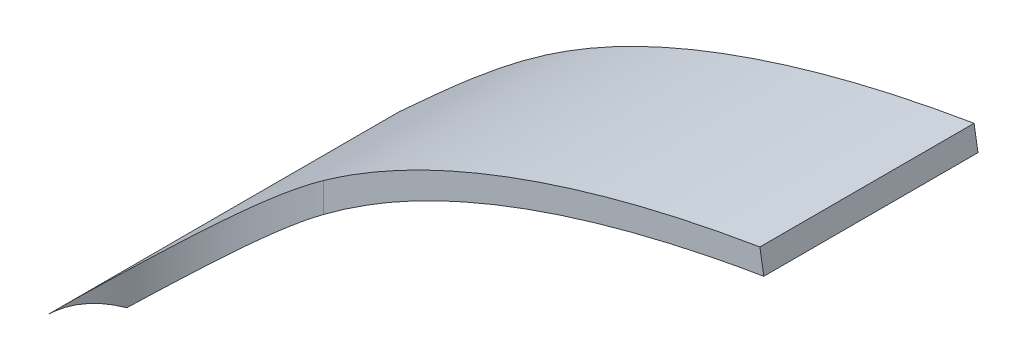
ISO-10303-21;
HEADER;
FILE_DESCRIPTION(('STEP AP214'),'2;1');
FILE_NAME('part.step','',(''),(''),'','','');
FILE_SCHEMA(('AUTOMOTIVE_DESIGN { 1 0 10303 214 1 1 1 1 }'));
ENDSEC;
DATA;
#1=APPLICATION_CONTEXT('core data for automotive mechanical design processes');
#2=APPLICATION_PROTOCOL_DEFINITION('international standard','automotive_design',2000,#1);
#3=PRODUCT_CONTEXT('',#1,'mechanical');
#4=PRODUCT('Part','Part','',(#3));
#5=PRODUCT_RELATED_PRODUCT_CATEGORY('part','',(#4));
#6=PRODUCT_DEFINITION_FORMATION('','',#4);
#7=PRODUCT_DEFINITION_CONTEXT('part definition',#1,'design');
#8=PRODUCT_DEFINITION('design','',#6,#7);
#9=PRODUCT_DEFINITION_SHAPE('','',#8);
#10=(LENGTH_UNIT() NAMED_UNIT(*) SI_UNIT(.MILLI.,.METRE.));
#11=(NAMED_UNIT(*) PLANE_ANGLE_UNIT() SI_UNIT($,.RADIAN.));
#12=(NAMED_UNIT(*) SI_UNIT($,.STERADIAN.) SOLID_ANGLE_UNIT());
#13=UNCERTAINTY_MEASURE_WITH_UNIT(LENGTH_MEASURE(1.E-05),#10,'distance_accuracy_value','');
#14=(GEOMETRIC_REPRESENTATION_CONTEXT(3) GLOBAL_UNCERTAINTY_ASSIGNED_CONTEXT((#13)) GLOBAL_UNIT_ASSIGNED_CONTEXT((#10,
#11,#12)) REPRESENTATION_CONTEXT('',''));
#15=CARTESIAN_POINT('',(0.,0.,0.));
#16=DIRECTION('',(0.,0.,1.));
#17=DIRECTION('',(1.,0.,0.));
#18=AXIS2_PLACEMENT_3D('',#15,#16,#17);
#19=CARTESIAN_POINT('',(0.,17.,10.));
#20=CARTESIAN_POINT('',(-1.92387366551589,16.6771904581056,10.));
#21=CARTESIAN_POINT('',(-5.62048772460826,15.8091540081434,10.));
#22=CARTESIAN_POINT('',(-10.6672018109282,13.5202587298351,10.));
#23=CARTESIAN_POINT('',(-13.2757006839175,11.1183251769361,10.));
#24=CARTESIAN_POINT('',(-14.5,10.,10.));
#25=B_SPLINE_CURVE_WITH_KNOTS('',3,(#19,#20,#21,#22,#23,#24),.UNSPECIFIED.,.F.,.F.,(4,1,1,4),
(0.,0.35691261152132,0.695162256038272,1.),.UNSPECIFIED.);
#26=DIRECTION('',(0.,0.,-1.));
#27=VECTOR('',#26,1.);
#28=SURFACE_OF_LINEAR_EXTRUSION('',#25,#27);
#29=CARTESIAN_POINT('',(0.,17.,5.4));
#30=CARTESIAN_POINT('',(-1.92387366551589,16.6771904581056,5.4));
#31=CARTESIAN_POINT('',(-5.62048772460826,15.8091540081434,5.4));
#32=CARTESIAN_POINT('',(-10.6672018109282,13.5202587298351,5.4));
#33=CARTESIAN_POINT('',(-13.2757006839175,11.1183251769361,5.4));
#34=CARTESIAN_POINT('',(-14.5,10.,5.4));
#35=B_SPLINE_CURVE_WITH_KNOTS('',3,(#29,#30,#31,#32,#33,#34),.UNSPECIFIED.,.F.,.F.,(4,1,1,4),
(0.,0.35691261152132,0.695162256038272,1.),.UNSPECIFIED.);
#36=CARTESIAN_POINT('',(0.,17.,5.4));
#37=VERTEX_POINT('',#36);
#38=CARTESIAN_POINT('',(-11.,12.9510138024321,5.4));
#39=VERTEX_POINT('',#38);
#40=EDGE_CURVE('E108',#37,#39,#35,.T.);
#41=ORIENTED_EDGE('',*,*,#40,.F.);
#42=DIRECTION('',(0.,0.,-1.));
#43=VECTOR('',#42,1.);
#44=CARTESIAN_POINT('',(0.,17.,10.));
#45=LINE('',#44,#43);
#46=CARTESIAN_POINT('',(0.,17.,0.));
#47=VERTEX_POINT('',#46);
#48=EDGE_CURVE('E66',#37,#47,#45,.T.);
#49=ORIENTED_EDGE('',*,*,#48,.T.);
#50=CARTESIAN_POINT('',(0.,17.,0.));
#51=CARTESIAN_POINT('',(-1.92387366551589,16.6771904581056,0.));
#52=CARTESIAN_POINT('',(-5.62048772460826,15.8091540081434,0.));
#53=CARTESIAN_POINT('',(-10.6672018109282,13.5202587298351,0.));
#54=CARTESIAN_POINT('',(-13.2757006839175,11.1183251769361,0.));
#55=CARTESIAN_POINT('',(-14.5,10.,0.));
#56=B_SPLINE_CURVE_WITH_KNOTS('',3,(#50,#51,#52,#53,#54,#55),.UNSPECIFIED.,.F.,.F.,(4,1,1,4),
(0.,0.35691261152132,0.695162256038272,1.),.UNSPECIFIED.);
#57=CARTESIAN_POINT('',(-14.5,10.,0.));
#58=VERTEX_POINT('',#57);
#59=EDGE_CURVE('E99',#47,#58,#56,.T.);
#60=ORIENTED_EDGE('',*,*,#59,.T.);
#61=DIRECTION('',(0.,0.,-1.));
#62=VECTOR('',#61,1.);
#63=CARTESIAN_POINT('',(-14.5,10.,10.));
#64=LINE('',#63,#62);
#65=CARTESIAN_POINT('',(-14.5,10.,8.9));
#66=VERTEX_POINT('',#65);
#67=EDGE_CURVE('E105',#66,#58,#64,.T.);
#68=ORIENTED_EDGE('',*,*,#67,.F.);
#69=CARTESIAN_POINT('',(-11.,12.9510138024321,5.4));
#70=CARTESIAN_POINT('',(-11.1207210362699,12.8653711583919,5.40002826827791));
#71=CARTESIAN_POINT('',(-11.2403272775594,12.7782434289402,5.40624533008585));
#72=CARTESIAN_POINT('',(-11.4767540670871,12.6019953960518,5.4305805153093));
#73=CARTESIAN_POINT('',(-11.5935758533821,12.5128760136582,5.448693243234));
#74=CARTESIAN_POINT('',(-11.8249299275096,12.3328098006543,5.49653891952134));
#75=CARTESIAN_POINT('',(-11.9394356862005,12.2418539860986,5.52636566677282));
#76=CARTESIAN_POINT('',(-12.1647725867874,12.059765267585,5.59738482108524));
#77=CARTESIAN_POINT('',(-12.2756027599258,11.9686323235375,5.63858019827255));
#78=CARTESIAN_POINT('',(-12.495961058285,11.784830877574,5.73347739363892));
#79=CARTESIAN_POINT('',(-12.6053793329101,11.6921845458931,5.78747810515986));
#80=CARTESIAN_POINT('',(-12.8192345308152,11.5089613414559,5.90744041415602));
#81=CARTESIAN_POINT('',(-12.9236729643964,11.4183838456548,5.97339835568795));
#82=CARTESIAN_POINT('',(-13.1264668957097,11.2408894166357,6.11727880078463));
#83=CARTESIAN_POINT('',(-13.2248433687233,11.1539602366916,6.19515637116654));
#84=CARTESIAN_POINT('',(-13.4149896702411,10.9848087540005,6.36347459123423));
#85=CARTESIAN_POINT('',(-13.5067516858763,10.9025920402583,6.45392973970901));
#86=CARTESIAN_POINT('',(-13.7054212991926,10.7237740807538,6.673334557995));
#87=CARTESIAN_POINT('',(-13.809904118662,10.6291296952763,6.80613464952465));
#88=CARTESIAN_POINT('',(-14.0018463319038,10.4547591154933,7.09212761183619));
#89=CARTESIAN_POINT('',(-14.0893454595565,10.3749981183666,7.24527143730946));
#90=CARTESIAN_POINT('',(-14.1978208297138,10.2760180196234,7.47537161537474));
#91=CARTESIAN_POINT('',(-14.2278403125432,10.2486125225477,7.54469448558604));
#92=CARTESIAN_POINT('',(-14.2837213020052,10.1975838702779,7.68634359467299));
#93=CARTESIAN_POINT('',(-14.3095840425239,10.1739595926765,7.75866893424551));
#94=CARTESIAN_POINT('',(-14.3567412035792,10.1308800165715,7.90589019190933));
#95=CARTESIAN_POINT('',(-14.3780418714875,10.1114190168541,7.98078242958236));
#96=CARTESIAN_POINT('',(-14.4157694759254,10.0769497862316,8.13276348733777));
#97=CARTESIAN_POINT('',(-14.4321975271549,10.0619405369076,8.20985180059806));
#98=CARTESIAN_POINT('',(-14.4638164892189,10.0330534875883,8.38786464857631));
#99=CARTESIAN_POINT('',(-14.4773365131398,10.0207025961968,8.48935137099004));
#100=CARTESIAN_POINT('',(-14.4909075660359,10.0083055195272,8.64268325861639));
#101=CARTESIAN_POINT('',(-14.494313121111,10.0051946728077,8.6940233938103));
#102=CARTESIAN_POINT('',(-14.4988602824024,10.0010410668929,8.79690420595051));
#103=CARTESIAN_POINT('',(-14.5000011370064,9.99999899428542,8.84844494378878));
#104=CARTESIAN_POINT('',(-14.5,10.,8.9));
#105=B_SPLINE_CURVE_WITH_KNOTS('',3,(#69,#70,#71,#72,#73,#74,#75,#76,#77,#78,#79,#80,#81,#82,
#83,#84,#85,#86,#87,#88,#89,#90,#91,#92,#93,#94,#95,#96,#97,#98,#99,#100,#101,#102,#103,#104),
.UNSPECIFIED.,.F.,.F.,(4,2,2,2,2,2,2,2,2,2,2,2,2,2,2,2,2,4),(0.,0.443831131453265,
0.887461094305581,1.3347182833757,1.78209243201193,2.24116628916175,2.70010001971193,
3.1573444920327,3.61512049087347,4.19413013202599,4.77176838801596,5.01264987494494,
5.25345972609926,5.49393766967353,5.73436055702476,6.04293873415208,6.19750132352687,
6.35211520079073),.UNSPECIFIED.);
#106=EDGE_CURVE('E92',#39,#66,#105,.T.);
#107=ORIENTED_EDGE('',*,*,#106,.F.);
#108=EDGE_LOOP('',(#41,#49,#60,#68,#107));
#109=FACE_BOUND('',#108,.T.);
#110=ADVANCED_FACE('F37',(#109),#28,.F.);
#111=CARTESIAN_POINT('',(-14.5,10.,10.));
#112=DIRECTION('',(0.738339333178899,0.674429410005924,0.));
#113=DIRECTION('',(-0.674429410005924,0.738339333178899,0.));
#114=AXIS2_PLACEMENT_3D('',#111,#112,#113);
#115=PLANE('',#114);
#116=CARTESIAN_POINT('',(-11.,6.16833485048725,8.9));
#117=DIRECTION('',(0.738339333178899,0.674429410005924,0.));
#118=DIRECTION('',(0.674429410005924,-0.738339333178899,0.));
#119=AXIS2_PLACEMENT_3D('',#116,#117,#118);
#120=ELLIPSE('',#119,5.1895720264768,3.5);
#121=CARTESIAN_POINT('',(-14.0953423539964,9.55699640009266,7.26633672026463));
#122=VERTEX_POINT('',#121);
#123=EDGE_CURVE('E95',#66,#122,#120,.F.);
#124=ORIENTED_EDGE('',*,*,#123,.F.);
#125=ORIENTED_EDGE('',*,*,#67,.T.);
#126=DIRECTION('',(0.674429410005924,-0.738339333178899,0.));
#127=VECTOR('',#126,1.);
#128=CARTESIAN_POINT('',(-14.5,10.,0.));
#129=LINE('',#128,#127);
#130=CARTESIAN_POINT('',(-14.0953423539964,9.55699640009266,0.));
#131=VERTEX_POINT('',#130);
#132=EDGE_CURVE('E124',#58,#131,#129,.T.);
#133=ORIENTED_EDGE('',*,*,#132,.T.);
#134=DIRECTION('',(0.,0.,-1.));
#135=VECTOR('',#134,1.);
#136=CARTESIAN_POINT('',(-14.0953423539964,9.55699640009266,10.));
#137=LINE('',#136,#135);
#138=EDGE_CURVE('E107',#122,#131,#137,.T.);
#139=ORIENTED_EDGE('',*,*,#138,.F.);
#140=EDGE_LOOP('',(#124,#125,#133,#139));
#141=FACE_BOUND('',#140,.T.);
#142=ADVANCED_FACE('F103',(#141),#115,.F.);
#143=CARTESIAN_POINT('',(-14.0953423539964,9.55699640009266,10.));
#144=CARTESIAN_POINT('',(-13.1018048706303,10.464534260551,10.));
#145=CARTESIAN_POINT('',(-11.591320399711,11.8561939183429,10.));
#146=CARTESIAN_POINT('',(-9.40820723150831,13.3081089476366,10.));
#147=CARTESIAN_POINT('',(-7.0317061016707,14.5122169088866,10.));
#148=CARTESIAN_POINT('',(-3.85682978935934,15.6200466139857,10.));
#149=CARTESIAN_POINT('',(-1.22479853157883,16.186101720185,10.));
#150=CARTESIAN_POINT('',(0.0992869079312353,16.4082719290811,10.));
#151=B_SPLINE_CURVE_WITH_KNOTS('',3,(#143,#144,#145,#146,#147,#148,#149,#150),.UNSPECIFIED.,.F.,
.F.,(4,1,1,1,1,4),(0.,0.25,0.375,0.5,0.75,1.),.UNSPECIFIED.);
#152=DIRECTION('',(0.,0.,-1.));
#153=VECTOR('',#152,1.);
#154=SURFACE_OF_LINEAR_EXTRUSION('',#151,#153);
#155=CARTESIAN_POINT('',(-14.0953423539964,9.55699640009266,5.4));
#156=CARTESIAN_POINT('',(-13.1018048706303,10.464534260551,5.4));
#157=CARTESIAN_POINT('',(-11.591320399711,11.8561939183429,5.4));
#158=CARTESIAN_POINT('',(-9.40820723150831,13.3081089476366,5.4));
#159=CARTESIAN_POINT('',(-7.0317061016707,14.5122169088866,5.4));
#160=CARTESIAN_POINT('',(-3.85682978935934,15.6200466139857,5.4));
#161=CARTESIAN_POINT('',(-1.22479853157883,16.186101720185,5.4));
#162=CARTESIAN_POINT('',(0.0992869079312353,16.4082719290811,5.4));
#163=B_SPLINE_CURVE_WITH_KNOTS('',3,(#155,#156,#157,#158,#159,#160,#161,#162),.UNSPECIFIED.,.F.,
.F.,(4,1,1,1,1,4),(0.,0.25,0.375,0.5,0.75,1.),.UNSPECIFIED.);
#164=CARTESIAN_POINT('',(-11.,12.2089439319963,5.4));
#165=VERTEX_POINT('',#164);
#166=CARTESIAN_POINT('',(0.0992869079312353,16.4082719290811,5.4));
#167=VERTEX_POINT('',#166);
#168=EDGE_CURVE('E58',#165,#167,#163,.T.);
#169=ORIENTED_EDGE('',*,*,#168,.F.);
#170=CARTESIAN_POINT('',(-14.0953423539964,9.55699640009266,7.26633672026463));
#171=CARTESIAN_POINT('',(-14.0458194250223,9.60222662670724,7.17252011867033));
#172=CARTESIAN_POINT('',(-13.9927702389718,9.65071033422738,7.08232065718503));
#173=CARTESIAN_POINT('',(-13.8806278330839,9.75318159689802,6.90937327742876));
#174=CARTESIAN_POINT('',(-13.8215462767262,9.80715853036013,6.82661154015417));
#175=CARTESIAN_POINT('',(-13.6375030692382,9.97515254476524,6.59063728545055));
#176=CARTESIAN_POINT('',(-13.5048725771575,10.0960304591183,6.4481460393731));
#177=CARTESIAN_POINT('',(-13.2765378997433,10.3028479969644,6.23883568803079));
#178=CARTESIAN_POINT('',(-13.1851890563489,10.3852903892996,6.163457733987));
#179=CARTESIAN_POINT('',(-12.9974709985693,10.5537004243249,6.02357915715541));
#180=CARTESIAN_POINT('',(-12.9011011468029,10.639668514281,5.95907991976824));
#181=CARTESIAN_POINT('',(-12.7036045276751,10.814407601674,5.84041198308629));
#182=CARTESIAN_POINT('',(-12.6024559597356,10.9031906818327,5.78629778373705));
#183=CARTESIAN_POINT('',(-12.3963732819944,11.0821448882232,5.68859168925916));
#184=CARTESIAN_POINT('',(-12.2914390603082,11.1723160554344,5.64500010541835));
#185=CARTESIAN_POINT('',(-12.0903010517599,11.3428471972639,5.57263865724693));
#186=CARTESIAN_POINT('',(-11.9944574677828,11.4231596161254,5.54274830813209));
#187=CARTESIAN_POINT('',(-11.8003673883086,11.5835081677145,5.49126294392375));
#188=CARTESIAN_POINT('',(-11.7021213339525,11.6635443481304,5.46966641790718));
#189=CARTESIAN_POINT('',(-11.5043114757036,11.8220372360512,5.43508010393187));
#190=CARTESIAN_POINT('',(-11.4047668672594,11.9005016444149,5.4220162732046));
#191=CARTESIAN_POINT('',(-11.2037533904411,12.0559756176685,5.40448366757515));
#192=CARTESIAN_POINT('',(-11.1022838872031,12.1329846852375,5.40001778000483));
#193=CARTESIAN_POINT('',(-11.,12.2089439319963,5.4));
#194=B_SPLINE_CURVE_WITH_KNOTS('',3,(#170,#171,#172,#173,#174,#175,#176,#177,#178,#179,#180,
#181,#182,#183,#184,#185,#186,#187,#188,#189,#190,#191,#192,#193),.UNSPECIFIED.,.F.,.F.,(4,2,2,
2,2,2,2,2,2,2,2,4),(0.,0.345569454127841,0.690482973221675,1.37445632078347,1.80692063879197,
2.23943998945951,2.67417056424176,3.10891399797177,3.49433369669286,3.8796831484276,
4.26164265345959,4.64373040446795),.UNSPECIFIED.);
#195=EDGE_CURVE('E11',#122,#165,#194,.T.);
#196=ORIENTED_EDGE('',*,*,#195,.F.);
#197=ORIENTED_EDGE('',*,*,#138,.T.);
#198=CARTESIAN_POINT('',(-14.0953423539964,9.55699640009266,0.));
#199=CARTESIAN_POINT('',(-13.1018048706303,10.464534260551,0.));
#200=CARTESIAN_POINT('',(-11.591320399711,11.8561939183429,0.));
#201=CARTESIAN_POINT('',(-9.40820723150831,13.3081089476366,0.));
#202=CARTESIAN_POINT('',(-7.0317061016707,14.5122169088866,0.));
#203=CARTESIAN_POINT('',(-3.85682978935934,15.6200466139857,0.));
#204=CARTESIAN_POINT('',(-1.22479853157883,16.186101720185,0.));
#205=CARTESIAN_POINT('',(0.0992869079312353,16.4082719290811,0.));
#206=B_SPLINE_CURVE_WITH_KNOTS('',3,(#198,#199,#200,#201,#202,#203,#204,#205),.UNSPECIFIED.,.F.,
.F.,(4,1,1,1,1,4),(0.,0.25,0.375,0.5,0.75,1.),.UNSPECIFIED.);
#207=CARTESIAN_POINT('',(0.0992869079312353,16.4082719290811,0.));
#208=VERTEX_POINT('',#207);
#209=EDGE_CURVE('E119',#131,#208,#206,.T.);
#210=ORIENTED_EDGE('',*,*,#209,.T.);
#211=DIRECTION('',(0.,0.,-1.));
#212=VECTOR('',#211,1.);
#213=CARTESIAN_POINT('',(0.0992869079312353,16.4082719290811,10.));
#214=LINE('',#213,#212);
#215=EDGE_CURVE('E112',#167,#208,#214,.T.);
#216=ORIENTED_EDGE('',*,*,#215,.F.);
#217=EDGE_LOOP('',(#169,#196,#197,#210,#216));
#218=FACE_BOUND('',#217,.T.);
#219=ADVANCED_FACE('F144',(#218),#154,.F.);
#220=CARTESIAN_POINT('',(0.0992869079312353,16.4082719290811,10.));
#221=DIRECTION('',(-0.986213451531573,-0.165478179885392,0.));
#222=DIRECTION('',(0.165478179885392,-0.986213451531573,0.));
#223=AXIS2_PLACEMENT_3D('',#220,#221,#222);
#224=PLANE('',#223);
#225=DIRECTION('',(-0.165478179885392,0.986213451531573,0.));
#226=VECTOR('',#225,1.);
#227=CARTESIAN_POINT('',(0.0992869079312353,16.4082719290811,5.4));
#228=LINE('',#227,#226);
#229=EDGE_CURVE('E51',#167,#37,#228,.T.);
#230=ORIENTED_EDGE('',*,*,#229,.F.);
#231=ORIENTED_EDGE('',*,*,#215,.T.);
#232=DIRECTION('',(-0.165478179885392,0.986213451531573,0.));
#233=VECTOR('',#232,1.);
#234=CARTESIAN_POINT('',(0.0992869079312353,16.4082719290811,0.));
#235=LINE('',#234,#233);
#236=EDGE_CURVE('E117',#208,#47,#235,.T.);
#237=ORIENTED_EDGE('',*,*,#236,.T.);
#238=ORIENTED_EDGE('',*,*,#48,.F.);
#239=EDGE_LOOP('',(#230,#231,#237,#238));
#240=FACE_BOUND('',#239,.T.);
#241=ADVANCED_FACE('F148',(#240),#224,.F.);
#242=CARTESIAN_POINT('',(-7.85913355877318,14.7315402537369,0.));
#243=DIRECTION('',(0.,0.,-1.));
#244=DIRECTION('',(-1.,0.,0.));
#245=AXIS2_PLACEMENT_3D('',#242,#243,#244);
#246=PLANE('',#245);
#247=ORIENTED_EDGE('',*,*,#59,.F.);
#248=ORIENTED_EDGE('',*,*,#236,.F.);
#249=ORIENTED_EDGE('',*,*,#209,.F.);
#250=ORIENTED_EDGE('',*,*,#132,.F.);
#251=EDGE_LOOP('',(#247,#248,#249,#250));
#252=FACE_BOUND('',#251,.T.);
#253=ADVANCED_FACE('F164',(#252),#246,.T.);
#254=CARTESIAN_POINT('',(-11.,31.,8.9));
#255=DIRECTION('',(0.,-1.,0.));
#256=DIRECTION('',(0.,0.,-1.));
#257=AXIS2_PLACEMENT_3D('',#254,#255,#256);
#258=CYLINDRICAL_SURFACE('',#257,3.5);
#259=ORIENTED_EDGE('',*,*,#106,.T.);
#260=ORIENTED_EDGE('',*,*,#123,.T.);
#261=ORIENTED_EDGE('',*,*,#195,.T.);
#262=DIRECTION('',(0.,-1.,0.));
#263=VECTOR('',#262,1.);
#264=CARTESIAN_POINT('',(-11.,31.,5.4));
#265=LINE('',#264,#263);
#266=EDGE_CURVE('E97',#39,#165,#265,.T.);
#267=ORIENTED_EDGE('',*,*,#266,.F.);
#268=EDGE_LOOP('',(#259,#260,#261,#267));
#269=FACE_BOUND('',#268,.T.);
#270=ADVANCED_FACE('F94',(#269),#258,.F.);
#271=CARTESIAN_POINT('',(2.54240303551038,31.,5.4));
#272=DIRECTION('',(0.,0.,1.));
#273=DIRECTION('',(1.,0.,0.));
#274=AXIS2_PLACEMENT_3D('',#271,#272,#273);
#275=PLANE('',#274);
#276=ORIENTED_EDGE('',*,*,#40,.T.);
#277=ORIENTED_EDGE('',*,*,#266,.T.);
#278=ORIENTED_EDGE('',*,*,#168,.T.);
#279=ORIENTED_EDGE('',*,*,#229,.T.);
#280=EDGE_LOOP('',(#276,#277,#278,#279));
#281=FACE_BOUND('',#280,.T.);
#282=ADVANCED_FACE('F189',(#281),#275,.T.);
#283=CLOSED_SHELL('',(#110,#142,#219,#241,#253,#270,#282));
#284=MANIFOLD_SOLID_BREP('B2',#283);
#285=ADVANCED_BREP_SHAPE_REPRESENTATION('',(#18,#284),#14);
#286=SHAPE_DEFINITION_REPRESENTATION(#9,#285);
ENDSEC;
END-ISO-10303-21;
